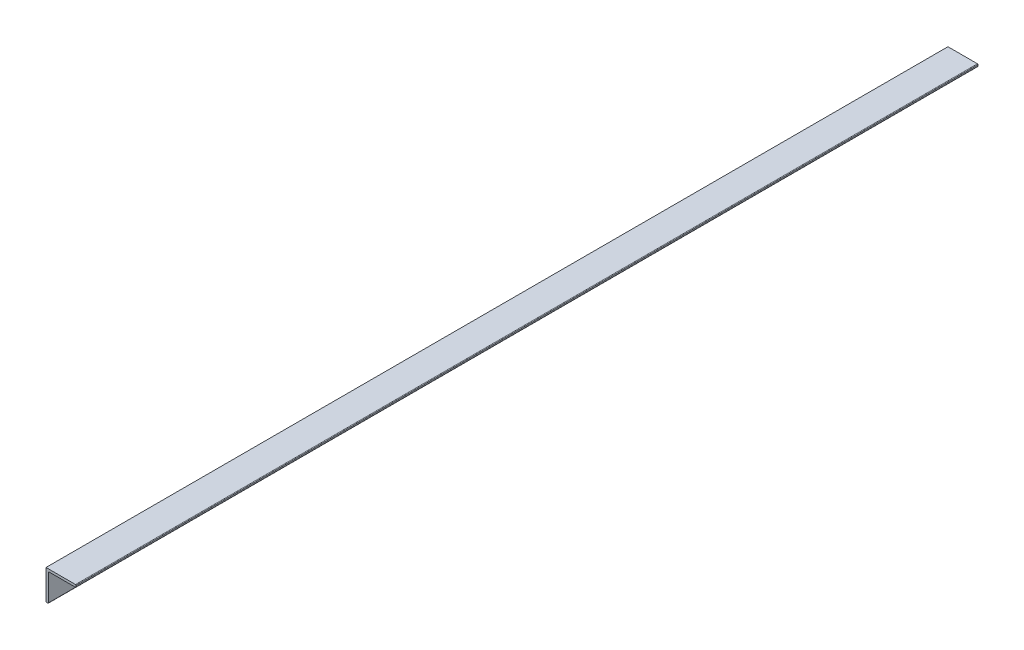
ISO-10303-21;
HEADER;
FILE_DESCRIPTION(('STEP AP214'),'2;1');
FILE_NAME('part.step','',(''),(''),'','','');
FILE_SCHEMA(('AUTOMOTIVE_DESIGN { 1 0 10303 214 1 1 1 1 }'));
ENDSEC;
DATA;
#1=APPLICATION_CONTEXT('core data for automotive mechanical design processes');
#2=APPLICATION_PROTOCOL_DEFINITION('international standard','automotive_design',2000,#1);
#3=PRODUCT_CONTEXT('',#1,'mechanical');
#4=PRODUCT('Part','Part','',(#3));
#5=PRODUCT_RELATED_PRODUCT_CATEGORY('part','',(#4));
#6=PRODUCT_DEFINITION_FORMATION('','',#4);
#7=PRODUCT_DEFINITION_CONTEXT('part definition',#1,'design');
#8=PRODUCT_DEFINITION('design','',#6,#7);
#9=PRODUCT_DEFINITION_SHAPE('','',#8);
#10=(LENGTH_UNIT() NAMED_UNIT(*) SI_UNIT(.MILLI.,.METRE.));
#11=(NAMED_UNIT(*) PLANE_ANGLE_UNIT() SI_UNIT($,.RADIAN.));
#12=(NAMED_UNIT(*) SI_UNIT($,.STERADIAN.) SOLID_ANGLE_UNIT());
#13=UNCERTAINTY_MEASURE_WITH_UNIT(LENGTH_MEASURE(1.E-05),#10,'distance_accuracy_value','');
#14=(GEOMETRIC_REPRESENTATION_CONTEXT(3) GLOBAL_UNCERTAINTY_ASSIGNED_CONTEXT((#13)) GLOBAL_UNIT_ASSIGNED_CONTEXT((#10,
#11,#12)) REPRESENTATION_CONTEXT('',''));
#15=CARTESIAN_POINT('',(0.,0.,0.));
#16=DIRECTION('',(0.,0.,1.));
#17=DIRECTION('',(1.,0.,0.));
#18=AXIS2_PLACEMENT_3D('',#15,#16,#17);
#19=CARTESIAN_POINT('',(-15.,15.,750.));
#20=DIRECTION('',(0.,-1.,0.));
#21=DIRECTION('',(0.,0.,-1.));
#22=AXIS2_PLACEMENT_3D('',#19,#20,#21);
#23=PLANE('',#22);
#24=DIRECTION('',(-1.,0.,0.));
#25=VECTOR('',#24,1.);
#26=CARTESIAN_POINT('',(-15.,15.,0.));
#27=LINE('',#26,#25);
#28=CARTESIAN_POINT('',(9.5,15.,0.));
#29=VERTEX_POINT('',#28);
#30=CARTESIAN_POINT('',(-15.,15.,0.));
#31=VERTEX_POINT('',#30);
#32=EDGE_CURVE('E149',#29,#31,#27,.T.);
#33=ORIENTED_EDGE('',*,*,#32,.T.);
#34=DIRECTION('',(0.,0.,-1.));
#35=VECTOR('',#34,1.);
#36=CARTESIAN_POINT('',(-15.,15.,750.));
#37=LINE('',#36,#35);
#38=CARTESIAN_POINT('',(-15.,15.,750.));
#39=VERTEX_POINT('',#38);
#40=EDGE_CURVE('E11',#39,#31,#37,.T.);
#41=ORIENTED_EDGE('',*,*,#40,.F.);
#42=DIRECTION('',(-1.,0.,0.));
#43=VECTOR('',#42,1.);
#44=CARTESIAN_POINT('',(-15.,15.,750.));
#45=LINE('',#44,#43);
#46=CARTESIAN_POINT('',(9.5,15.,750.));
#47=VERTEX_POINT('',#46);
#48=EDGE_CURVE('E169',#47,#39,#45,.T.);
#49=ORIENTED_EDGE('',*,*,#48,.F.);
#50=DIRECTION('',(0.,0.,-1.));
#51=VECTOR('',#50,1.);
#52=CARTESIAN_POINT('',(9.5,15.,750.));
#53=LINE('',#52,#51);
#54=EDGE_CURVE('E145',#47,#29,#53,.T.);
#55=ORIENTED_EDGE('',*,*,#54,.T.);
#56=EDGE_LOOP('',(#33,#41,#49,#55));
#57=FACE_BOUND('',#56,.T.);
#58=ADVANCED_FACE('F35',(#57),#23,.F.);
#59=CARTESIAN_POINT('',(-15.,-9.5,750.));
#60=DIRECTION('',(1.,0.,0.));
#61=DIRECTION('',(0.,0.,-1.));
#62=AXIS2_PLACEMENT_3D('',#59,#60,#61);
#63=PLANE('',#62);
#64=DIRECTION('',(0.,-1.,0.));
#65=VECTOR('',#64,1.);
#66=CARTESIAN_POINT('',(-15.,-9.5,0.));
#67=LINE('',#66,#65);
#68=CARTESIAN_POINT('',(-15.,-9.5,0.));
#69=VERTEX_POINT('',#68);
#70=EDGE_CURVE('E152',#31,#69,#67,.T.);
#71=ORIENTED_EDGE('',*,*,#70,.T.);
#72=DIRECTION('',(0.,0.,-1.));
#73=VECTOR('',#72,1.);
#74=CARTESIAN_POINT('',(-15.,-9.5,750.));
#75=LINE('',#74,#73);
#76=CARTESIAN_POINT('',(-15.,-9.5,750.));
#77=VERTEX_POINT('',#76);
#78=EDGE_CURVE('E43',#77,#69,#75,.T.);
#79=ORIENTED_EDGE('',*,*,#78,.F.);
#80=DIRECTION('',(0.,-1.,0.));
#81=VECTOR('',#80,1.);
#82=CARTESIAN_POINT('',(-15.,-9.5,750.));
#83=LINE('',#82,#81);
#84=EDGE_CURVE('E103',#39,#77,#83,.T.);
#85=ORIENTED_EDGE('',*,*,#84,.F.);
#86=ORIENTED_EDGE('',*,*,#40,.T.);
#87=EDGE_LOOP('',(#71,#79,#85,#86));
#88=FACE_BOUND('',#87,.T.);
#89=ADVANCED_FACE('F241',(#88),#63,.F.);
#90=CARTESIAN_POINT('',(-14.5,-9.5,750.));
#91=DIRECTION('',(0.,0.,-1.));
#92=DIRECTION('',(-1.,0.,0.));
#93=AXIS2_PLACEMENT_3D('',#90,#91,#92);
#94=CYLINDRICAL_SURFACE('',#93,0.5);
#95=CARTESIAN_POINT('',(-14.5,-9.5,0.));
#96=DIRECTION('',(0.,0.,1.));
#97=DIRECTION('',(-1.,0.,0.));
#98=AXIS2_PLACEMENT_3D('',#95,#96,#97);
#99=CIRCLE('',#98,0.5);
#100=CARTESIAN_POINT('',(-14.5,-10.,0.));
#101=VERTEX_POINT('',#100);
#102=EDGE_CURVE('E154',#69,#101,#99,.T.);
#103=ORIENTED_EDGE('',*,*,#102,.T.);
#104=DIRECTION('',(0.,0.,-1.));
#105=VECTOR('',#104,1.);
#106=CARTESIAN_POINT('',(-14.5,-10.,750.));
#107=LINE('',#106,#105);
#108=CARTESIAN_POINT('',(-14.5,-10.,750.));
#109=VERTEX_POINT('',#108);
#110=EDGE_CURVE('E185',#109,#101,#107,.T.);
#111=ORIENTED_EDGE('',*,*,#110,.F.);
#112=CARTESIAN_POINT('',(-14.5,-9.5,750.));
#113=DIRECTION('',(0.,0.,1.));
#114=DIRECTION('',(-1.,0.,0.));
#115=AXIS2_PLACEMENT_3D('',#112,#113,#114);
#116=CIRCLE('',#115,0.5);
#117=EDGE_CURVE('E193',#77,#109,#116,.T.);
#118=ORIENTED_EDGE('',*,*,#117,.F.);
#119=ORIENTED_EDGE('',*,*,#78,.T.);
#120=EDGE_LOOP('',(#103,#111,#118,#119));
#121=FACE_BOUND('',#120,.T.);
#122=ADVANCED_FACE('F191',(#121),#94,.T.);
#123=CARTESIAN_POINT('',(-14.5,-10.,750.));
#124=DIRECTION('',(0.,1.,0.));
#125=DIRECTION('',(0.,0.,1.));
#126=AXIS2_PLACEMENT_3D('',#123,#124,#125);
#127=PLANE('',#126);
#128=DIRECTION('',(1.,0.,0.));
#129=VECTOR('',#128,1.);
#130=CARTESIAN_POINT('',(-14.5,-10.,0.));
#131=LINE('',#130,#129);
#132=CARTESIAN_POINT('',(-13.5,-10.,0.));
#133=VERTEX_POINT('',#132);
#134=EDGE_CURVE('E156',#101,#133,#131,.T.);
#135=ORIENTED_EDGE('',*,*,#134,.T.);
#136=DIRECTION('',(0.,0.,-1.));
#137=VECTOR('',#136,1.);
#138=CARTESIAN_POINT('',(-13.5,-10.,750.));
#139=LINE('',#138,#137);
#140=CARTESIAN_POINT('',(-13.5,-10.,750.));
#141=VERTEX_POINT('',#140);
#142=EDGE_CURVE('E182',#141,#133,#139,.T.);
#143=ORIENTED_EDGE('',*,*,#142,.F.);
#144=DIRECTION('',(1.,0.,0.));
#145=VECTOR('',#144,1.);
#146=CARTESIAN_POINT('',(-14.5,-10.,750.));
#147=LINE('',#146,#145);
#148=EDGE_CURVE('E211',#109,#141,#147,.T.);
#149=ORIENTED_EDGE('',*,*,#148,.F.);
#150=ORIENTED_EDGE('',*,*,#110,.T.);
#151=EDGE_LOOP('',(#135,#143,#149,#150));
#152=FACE_BOUND('',#151,.T.);
#153=ADVANCED_FACE('F202',(#152),#127,.F.);
#154=CARTESIAN_POINT('',(-13.5,-9.5,750.));
#155=DIRECTION('',(0.,0.,-1.));
#156=DIRECTION('',(-1.,0.,0.));
#157=AXIS2_PLACEMENT_3D('',#154,#155,#156);
#158=CYLINDRICAL_SURFACE('',#157,0.500000000000002);
#159=CARTESIAN_POINT('',(-13.5,-9.5,0.));
#160=DIRECTION('',(0.,0.,1.));
#161=DIRECTION('',(1.,0.,0.));
#162=AXIS2_PLACEMENT_3D('',#159,#160,#161);
#163=CIRCLE('',#162,0.500000000000002);
#164=CARTESIAN_POINT('',(-13.,-9.5,0.));
#165=VERTEX_POINT('',#164);
#166=EDGE_CURVE('E158',#133,#165,#163,.T.);
#167=ORIENTED_EDGE('',*,*,#166,.T.);
#168=DIRECTION('',(0.,0.,-1.));
#169=VECTOR('',#168,1.);
#170=CARTESIAN_POINT('',(-13.,-9.5,750.));
#171=LINE('',#170,#169);
#172=CARTESIAN_POINT('',(-13.,-9.5,750.));
#173=VERTEX_POINT('',#172);
#174=EDGE_CURVE('E179',#173,#165,#171,.T.);
#175=ORIENTED_EDGE('',*,*,#174,.F.);
#176=CARTESIAN_POINT('',(-13.5,-9.5,750.));
#177=DIRECTION('',(0.,0.,1.));
#178=DIRECTION('',(1.,0.,0.));
#179=AXIS2_PLACEMENT_3D('',#176,#177,#178);
#180=CIRCLE('',#179,0.500000000000002);
#181=EDGE_CURVE('E208',#141,#173,#180,.T.);
#182=ORIENTED_EDGE('',*,*,#181,.F.);
#183=ORIENTED_EDGE('',*,*,#142,.T.);
#184=EDGE_LOOP('',(#167,#175,#182,#183));
#185=FACE_BOUND('',#184,.T.);
#186=ADVANCED_FACE('F206',(#185),#158,.T.);
#187=CARTESIAN_POINT('',(-13.,12.5,750.));
#188=DIRECTION('',(-1.,0.,0.));
#189=DIRECTION('',(0.,-1.,0.));
#190=AXIS2_PLACEMENT_3D('',#187,#188,#189);
#191=PLANE('',#190);
#192=DIRECTION('',(0.,1.,0.));
#193=VECTOR('',#192,1.);
#194=CARTESIAN_POINT('',(-13.,12.5,0.));
#195=LINE('',#194,#193);
#196=CARTESIAN_POINT('',(-13.,12.5,0.));
#197=VERTEX_POINT('',#196);
#198=EDGE_CURVE('E160',#165,#197,#195,.T.);
#199=ORIENTED_EDGE('',*,*,#198,.T.);
#200=DIRECTION('',(0.,0.,-1.));
#201=VECTOR('',#200,1.);
#202=CARTESIAN_POINT('',(-13.,12.5,750.));
#203=LINE('',#202,#201);
#204=CARTESIAN_POINT('',(-13.,12.5,750.));
#205=VERTEX_POINT('',#204);
#206=EDGE_CURVE('E176',#205,#197,#203,.T.);
#207=ORIENTED_EDGE('',*,*,#206,.F.);
#208=DIRECTION('',(0.,1.,0.));
#209=VECTOR('',#208,1.);
#210=CARTESIAN_POINT('',(-13.,12.5,750.));
#211=LINE('',#210,#209);
#212=EDGE_CURVE('E210',#173,#205,#211,.T.);
#213=ORIENTED_EDGE('',*,*,#212,.F.);
#214=ORIENTED_EDGE('',*,*,#174,.T.);
#215=EDGE_LOOP('',(#199,#207,#213,#214));
#216=FACE_BOUND('',#215,.T.);
#217=ADVANCED_FACE('F254',(#216),#191,.F.);
#218=CARTESIAN_POINT('',(-12.5,12.5,750.));
#219=DIRECTION('',(0.,0.,-1.));
#220=DIRECTION('',(-1.,0.,0.));
#221=AXIS2_PLACEMENT_3D('',#218,#219,#220);
#222=CYLINDRICAL_SURFACE('',#221,0.5);
#223=CARTESIAN_POINT('',(-12.5,12.5,0.));
#224=DIRECTION('',(0.,0.,-1.));
#225=DIRECTION('',(1.,0.,0.));
#226=AXIS2_PLACEMENT_3D('',#223,#224,#225);
#227=CIRCLE('',#226,0.5);
#228=CARTESIAN_POINT('',(-12.5,13.,0.));
#229=VERTEX_POINT('',#228);
#230=EDGE_CURVE('E162',#197,#229,#227,.T.);
#231=ORIENTED_EDGE('',*,*,#230,.T.);
#232=DIRECTION('',(0.,0.,-1.));
#233=VECTOR('',#232,1.);
#234=CARTESIAN_POINT('',(-12.5,13.,750.));
#235=LINE('',#234,#233);
#236=CARTESIAN_POINT('',(-12.5,13.,750.));
#237=VERTEX_POINT('',#236);
#238=EDGE_CURVE('E173',#237,#229,#235,.T.);
#239=ORIENTED_EDGE('',*,*,#238,.F.);
#240=CARTESIAN_POINT('',(-12.5,12.5,750.));
#241=DIRECTION('',(0.,0.,-1.));
#242=DIRECTION('',(1.,0.,0.));
#243=AXIS2_PLACEMENT_3D('',#240,#241,#242);
#244=CIRCLE('',#243,0.5);
#245=EDGE_CURVE('E213',#205,#237,#244,.T.);
#246=ORIENTED_EDGE('',*,*,#245,.F.);
#247=ORIENTED_EDGE('',*,*,#206,.T.);
#248=EDGE_LOOP('',(#231,#239,#246,#247));
#249=FACE_BOUND('',#248,.T.);
#250=ADVANCED_FACE('F222',(#249),#222,.F.);
#251=CARTESIAN_POINT('',(9.5,13.,750.));
#252=DIRECTION('',(0.,1.,0.));
#253=DIRECTION('',(-1.,0.,0.));
#254=AXIS2_PLACEMENT_3D('',#251,#252,#253);
#255=PLANE('',#254);
#256=DIRECTION('',(1.,0.,0.));
#257=VECTOR('',#256,1.);
#258=CARTESIAN_POINT('',(9.5,13.,0.));
#259=LINE('',#258,#257);
#260=CARTESIAN_POINT('',(9.5,13.,0.));
#261=VERTEX_POINT('',#260);
#262=EDGE_CURVE('E164',#229,#261,#259,.T.);
#263=ORIENTED_EDGE('',*,*,#262,.T.);
#264=DIRECTION('',(0.,0.,-1.));
#265=VECTOR('',#264,1.);
#266=CARTESIAN_POINT('',(9.5,13.,750.));
#267=LINE('',#266,#265);
#268=CARTESIAN_POINT('',(9.5,13.,750.));
#269=VERTEX_POINT('',#268);
#270=EDGE_CURVE('E140',#269,#261,#267,.T.);
#271=ORIENTED_EDGE('',*,*,#270,.F.);
#272=DIRECTION('',(1.,0.,0.));
#273=VECTOR('',#272,1.);
#274=CARTESIAN_POINT('',(9.5,13.,750.));
#275=LINE('',#274,#273);
#276=EDGE_CURVE('E131',#237,#269,#275,.T.);
#277=ORIENTED_EDGE('',*,*,#276,.F.);
#278=ORIENTED_EDGE('',*,*,#238,.T.);
#279=EDGE_LOOP('',(#263,#271,#277,#278));
#280=FACE_BOUND('',#279,.T.);
#281=ADVANCED_FACE('F226',(#280),#255,.F.);
#282=CARTESIAN_POINT('',(9.5,13.5,750.));
#283=DIRECTION('',(0.,0.,-1.));
#284=DIRECTION('',(-1.,0.,0.));
#285=AXIS2_PLACEMENT_3D('',#282,#283,#284);
#286=CYLINDRICAL_SURFACE('',#285,0.5);
#287=CARTESIAN_POINT('',(9.5,13.5,0.));
#288=DIRECTION('',(0.,0.,1.));
#289=DIRECTION('',(-1.,0.,0.));
#290=AXIS2_PLACEMENT_3D('',#287,#288,#289);
#291=CIRCLE('',#290,0.5);
#292=CARTESIAN_POINT('',(10.,13.5,0.));
#293=VERTEX_POINT('',#292);
#294=EDGE_CURVE('E139',#261,#293,#291,.T.);
#295=ORIENTED_EDGE('',*,*,#294,.T.);
#296=DIRECTION('',(0.,0.,-1.));
#297=VECTOR('',#296,1.);
#298=CARTESIAN_POINT('',(10.,13.5,750.));
#299=LINE('',#298,#297);
#300=CARTESIAN_POINT('',(10.,13.5,750.));
#301=VERTEX_POINT('',#300);
#302=EDGE_CURVE('E136',#301,#293,#299,.T.);
#303=ORIENTED_EDGE('',*,*,#302,.F.);
#304=CARTESIAN_POINT('',(9.5,13.5,750.));
#305=DIRECTION('',(0.,0.,1.));
#306=DIRECTION('',(-1.,0.,0.));
#307=AXIS2_PLACEMENT_3D('',#304,#305,#306);
#308=CIRCLE('',#307,0.5);
#309=EDGE_CURVE('E125',#269,#301,#308,.T.);
#310=ORIENTED_EDGE('',*,*,#309,.F.);
#311=ORIENTED_EDGE('',*,*,#270,.T.);
#312=EDGE_LOOP('',(#295,#303,#310,#311));
#313=FACE_BOUND('',#312,.T.);
#314=ADVANCED_FACE('F137',(#313),#286,.T.);
#315=CARTESIAN_POINT('',(10.,14.5,750.));
#316=DIRECTION('',(-1.,0.,0.));
#317=DIRECTION('',(0.,0.,1.));
#318=AXIS2_PLACEMENT_3D('',#315,#316,#317);
#319=PLANE('',#318);
#320=DIRECTION('',(0.,1.,0.));
#321=VECTOR('',#320,1.);
#322=CARTESIAN_POINT('',(10.,14.5,0.));
#323=LINE('',#322,#321);
#324=CARTESIAN_POINT('',(10.,14.5,0.));
#325=VERTEX_POINT('',#324);
#326=EDGE_CURVE('E89',#293,#325,#323,.T.);
#327=ORIENTED_EDGE('',*,*,#326,.T.);
#328=DIRECTION('',(0.,0.,-1.));
#329=VECTOR('',#328,1.);
#330=CARTESIAN_POINT('',(10.,14.5,750.));
#331=LINE('',#330,#329);
#332=CARTESIAN_POINT('',(10.,14.5,750.));
#333=VERTEX_POINT('',#332);
#334=EDGE_CURVE('E141',#333,#325,#331,.T.);
#335=ORIENTED_EDGE('',*,*,#334,.F.);
#336=DIRECTION('',(0.,1.,0.));
#337=VECTOR('',#336,1.);
#338=CARTESIAN_POINT('',(10.,14.5,750.));
#339=LINE('',#338,#337);
#340=EDGE_CURVE('E129',#301,#333,#339,.T.);
#341=ORIENTED_EDGE('',*,*,#340,.F.);
#342=ORIENTED_EDGE('',*,*,#302,.T.);
#343=EDGE_LOOP('',(#327,#335,#341,#342));
#344=FACE_BOUND('',#343,.T.);
#345=ADVANCED_FACE('F143',(#344),#319,.F.);
#346=CARTESIAN_POINT('',(9.5,14.5,750.));
#347=DIRECTION('',(0.,0.,-1.));
#348=DIRECTION('',(-1.,0.,0.));
#349=AXIS2_PLACEMENT_3D('',#346,#347,#348);
#350=CYLINDRICAL_SURFACE('',#349,0.5);
#351=CARTESIAN_POINT('',(9.5,14.5,0.));
#352=DIRECTION('',(0.,0.,1.));
#353=DIRECTION('',(-1.,0.,0.));
#354=AXIS2_PLACEMENT_3D('',#351,#352,#353);
#355=CIRCLE('',#354,0.5);
#356=EDGE_CURVE('E95',#325,#29,#355,.T.);
#357=ORIENTED_EDGE('',*,*,#356,.T.);
#358=ORIENTED_EDGE('',*,*,#54,.F.);
#359=CARTESIAN_POINT('',(9.5,14.5,750.));
#360=DIRECTION('',(0.,0.,1.));
#361=DIRECTION('',(-1.,0.,0.));
#362=AXIS2_PLACEMENT_3D('',#359,#360,#361);
#363=CIRCLE('',#362,0.5);
#364=EDGE_CURVE('E51',#333,#47,#363,.T.);
#365=ORIENTED_EDGE('',*,*,#364,.F.);
#366=ORIENTED_EDGE('',*,*,#334,.T.);
#367=EDGE_LOOP('',(#357,#358,#365,#366));
#368=FACE_BOUND('',#367,.T.);
#369=ADVANCED_FACE('F230',(#368),#350,.T.);
#370=CARTESIAN_POINT('',(9.5,14.5,750.));
#371=DIRECTION('',(0.,0.,-1.));
#372=DIRECTION('',(-1.,0.,0.));
#373=AXIS2_PLACEMENT_3D('',#370,#371,#372);
#374=PLANE('',#373);
#375=ORIENTED_EDGE('',*,*,#48,.T.);
#376=ORIENTED_EDGE('',*,*,#84,.T.);
#377=ORIENTED_EDGE('',*,*,#117,.T.);
#378=ORIENTED_EDGE('',*,*,#148,.T.);
#379=ORIENTED_EDGE('',*,*,#181,.T.);
#380=ORIENTED_EDGE('',*,*,#212,.T.);
#381=ORIENTED_EDGE('',*,*,#245,.T.);
#382=ORIENTED_EDGE('',*,*,#276,.T.);
#383=ORIENTED_EDGE('',*,*,#309,.T.);
#384=ORIENTED_EDGE('',*,*,#340,.T.);
#385=ORIENTED_EDGE('',*,*,#364,.T.);
#386=EDGE_LOOP('',(#375,#376,#377,#378,#379,#380,#381,#382,#383,#384,#385));
#387=FACE_BOUND('',#386,.T.);
#388=ADVANCED_FACE('F127',(#387),#374,.F.);
#389=CARTESIAN_POINT('',(9.5,14.5,0.));
#390=DIRECTION('',(0.,0.,-1.));
#391=DIRECTION('',(-1.,0.,0.));
#392=AXIS2_PLACEMENT_3D('',#389,#390,#391);
#393=PLANE('',#392);
#394=ORIENTED_EDGE('',*,*,#32,.F.);
#395=ORIENTED_EDGE('',*,*,#356,.F.);
#396=ORIENTED_EDGE('',*,*,#326,.F.);
#397=ORIENTED_EDGE('',*,*,#294,.F.);
#398=ORIENTED_EDGE('',*,*,#262,.F.);
#399=ORIENTED_EDGE('',*,*,#230,.F.);
#400=ORIENTED_EDGE('',*,*,#198,.F.);
#401=ORIENTED_EDGE('',*,*,#166,.F.);
#402=ORIENTED_EDGE('',*,*,#134,.F.);
#403=ORIENTED_EDGE('',*,*,#102,.F.);
#404=ORIENTED_EDGE('',*,*,#70,.F.);
#405=EDGE_LOOP('',(#394,#395,#396,#397,#398,#399,#400,#401,#402,#403,#404));
#406=FACE_BOUND('',#405,.T.);
#407=ADVANCED_FACE('F197',(#406),#393,.T.);
#408=CLOSED_SHELL('',(#58,#89,#122,#153,#186,#217,#250,#281,#314,#345,#369,#388,#407));
#409=MANIFOLD_SOLID_BREP('B2',#408);
#410=ADVANCED_BREP_SHAPE_REPRESENTATION('',(#18,#409),#14);
#411=SHAPE_DEFINITION_REPRESENTATION(#9,#410);
ENDSEC;
END-ISO-10303-21;
